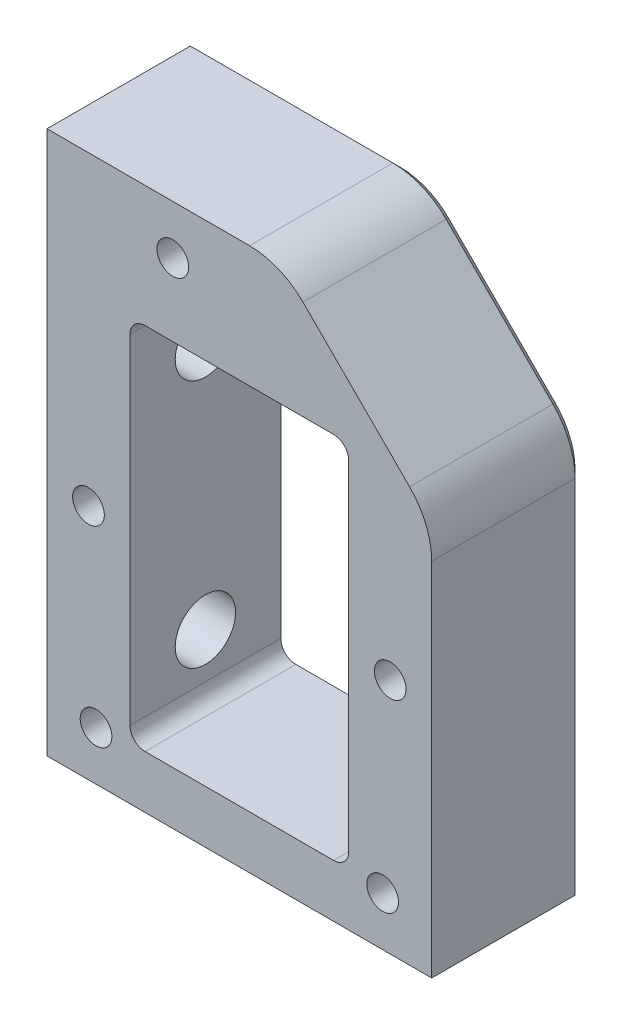
ISO-10303-21;
HEADER;
FILE_DESCRIPTION(('STEP AP214'),'2;1');
FILE_NAME('part.step','',(''),(''),'','','');
FILE_SCHEMA(('AUTOMOTIVE_DESIGN { 1 0 10303 214 1 1 1 1 }'));
ENDSEC;
DATA;
#1=APPLICATION_CONTEXT('core data for automotive mechanical design processes');
#2=APPLICATION_PROTOCOL_DEFINITION('international standard','automotive_design',2000,#1);
#3=PRODUCT_CONTEXT('',#1,'mechanical');
#4=PRODUCT('Part','Part','',(#3));
#5=PRODUCT_RELATED_PRODUCT_CATEGORY('part','',(#4));
#6=PRODUCT_DEFINITION_FORMATION('','',#4);
#7=PRODUCT_DEFINITION_CONTEXT('part definition',#1,'design');
#8=PRODUCT_DEFINITION('design','',#6,#7);
#9=PRODUCT_DEFINITION_SHAPE('','',#8);
#10=(LENGTH_UNIT() NAMED_UNIT(*) SI_UNIT(.MILLI.,.METRE.));
#11=(NAMED_UNIT(*) PLANE_ANGLE_UNIT() SI_UNIT($,.RADIAN.));
#12=(NAMED_UNIT(*) SI_UNIT($,.STERADIAN.) SOLID_ANGLE_UNIT());
#13=UNCERTAINTY_MEASURE_WITH_UNIT(LENGTH_MEASURE(1.E-05),#10,'distance_accuracy_value','');
#14=(GEOMETRIC_REPRESENTATION_CONTEXT(3) GLOBAL_UNCERTAINTY_ASSIGNED_CONTEXT((#13)) GLOBAL_UNIT_ASSIGNED_CONTEXT((#10,
#11,#12)) REPRESENTATION_CONTEXT('',''));
#15=CARTESIAN_POINT('',(0.,0.,0.));
#16=DIRECTION('',(0.,0.,1.));
#17=DIRECTION('',(1.,0.,0.));
#18=AXIS2_PLACEMENT_3D('',#15,#16,#17);
#19=CARTESIAN_POINT('',(0.,0.,20.));
#20=DIRECTION('',(0.,0.,1.));
#21=DIRECTION('',(1.,0.,0.));
#22=AXIS2_PLACEMENT_3D('',#19,#20,#21);
#23=PLANE('',#22);
#24=CARTESIAN_POINT('',(19.,-24.9500000000006,20.));
#25=DIRECTION('',(0.,0.,1.));
#26=DIRECTION('',(1.,0.,0.));
#27=AXIS2_PLACEMENT_3D('',#24,#25,#26);
#28=CIRCLE('',#27,2.1);
#29=CARTESIAN_POINT('',(21.1,-24.9500000000006,20.));
#30=VERTEX_POINT('',#29);
#31=EDGE_CURVE('E802',#30,#30,#28,.T.);
#32=ORIENTED_EDGE('',*,*,#31,.F.);
#33=EDGE_LOOP('',(#32));
#34=FACE_BOUND('',#33,.T.);
#35=CARTESIAN_POINT('',(-8.82106781186559,34.0499999999994,20.));
#36=DIRECTION('',(0.,0.,1.));
#37=DIRECTION('',(1.,0.,0.));
#38=AXIS2_PLACEMENT_3D('',#35,#36,#37);
#39=CIRCLE('',#38,2.1);
#40=CARTESIAN_POINT('',(-6.72106781186559,34.0499999999994,20.));
#41=VERTEX_POINT('',#40);
#42=EDGE_CURVE('E876',#41,#41,#39,.T.);
#43=ORIENTED_EDGE('',*,*,#42,.F.);
#44=EDGE_LOOP('',(#43));
#45=FACE_BOUND('',#44,.T.);
#46=CARTESIAN_POINT('',(-19.0000000000001,-24.9500000000006,20.));
#47=DIRECTION('',(0.,0.,1.));
#48=DIRECTION('',(1.,0.,0.));
#49=AXIS2_PLACEMENT_3D('',#46,#47,#48);
#50=CIRCLE('',#49,2.1);
#51=CARTESIAN_POINT('',(-16.9000000000001,-24.9500000000006,20.));
#52=VERTEX_POINT('',#51);
#53=EDGE_CURVE('E868',#52,#52,#50,.T.);
#54=ORIENTED_EDGE('',*,*,#53,.F.);
#55=EDGE_LOOP('',(#54));
#56=FACE_BOUND('',#55,.T.);
#57=CARTESIAN_POINT('',(20.,0.,20.));
#58=DIRECTION('',(0.,0.,-1.));
#59=DIRECTION('',(-1.,0.,0.));
#60=AXIS2_PLACEMENT_3D('',#57,#58,#59);
#61=CIRCLE('',#60,2.1);
#62=CARTESIAN_POINT('',(17.9,0.,20.));
#63=VERTEX_POINT('',#62);
#64=EDGE_CURVE('E373',#63,#63,#61,.T.);
#65=ORIENTED_EDGE('',*,*,#64,.T.);
#66=EDGE_LOOP('',(#65));
#67=FACE_BOUND('',#66,.T.);
#68=CARTESIAN_POINT('',(-20.,0.,20.));
#69=DIRECTION('',(0.,0.,-1.));
#70=DIRECTION('',(-1.,0.,0.));
#71=AXIS2_PLACEMENT_3D('',#68,#69,#70);
#72=CIRCLE('',#71,2.1);
#73=CARTESIAN_POINT('',(-22.1,0.,20.));
#74=VERTEX_POINT('',#73);
#75=EDGE_CURVE('E340',#74,#74,#72,.T.);
#76=ORIENTED_EDGE('',*,*,#75,.T.);
#77=EDGE_LOOP('',(#76));
#78=FACE_BOUND('',#77,.T.);
#79=DIRECTION('',(0.,1.,0.));
#80=VECTOR('',#79,1.);
#81=CARTESIAN_POINT('',(25.5,20.5499999999995,20.));
#82=LINE('',#81,#80);
#83=CARTESIAN_POINT('',(25.5,-31.4500000000006,20.));
#84=VERTEX_POINT('',#83);
#85=CARTESIAN_POINT('',(25.5,16.4078643762685,20.));
#86=VERTEX_POINT('',#85);
#87=EDGE_CURVE('E188',#84,#86,#82,.T.);
#88=ORIENTED_EDGE('',*,*,#87,.T.);
#89=CARTESIAN_POINT('',(15.5,16.4078643762685,20.));
#90=DIRECTION('',(0.,0.,1.));
#91=DIRECTION('',(1.,0.,0.));
#92=AXIS2_PLACEMENT_3D('',#89,#90,#91);
#93=CIRCLE('',#92,10.);
#94=CARTESIAN_POINT('',(22.5710678118655,23.478932188134,20.));
#95=VERTEX_POINT('',#94);
#96=EDGE_CURVE('E277',#86,#95,#93,.T.);
#97=ORIENTED_EDGE('',*,*,#96,.T.);
#98=DIRECTION('',(-0.707106781186551,0.707106781186544,0.));
#99=VECTOR('',#98,1.);
#100=CARTESIAN_POINT('',(25.5,20.5499999999995,20.));
#101=LINE('',#100,#99);
#102=CARTESIAN_POINT('',(8.4289321881344,37.6210678118649,20.));
#103=VERTEX_POINT('',#102);
#104=EDGE_CURVE('E386',#95,#103,#101,.T.);
#105=ORIENTED_EDGE('',*,*,#104,.T.);
#106=CARTESIAN_POINT('',(1.35786437626895,30.5499999999994,20.));
#107=DIRECTION('',(0.,0.,1.));
#108=DIRECTION('',(1.,0.,0.));
#109=AXIS2_PLACEMENT_3D('',#106,#107,#108);
#110=CIRCLE('',#109,10.);
#111=CARTESIAN_POINT('',(1.35786437626895,40.5499999999994,20.));
#112=VERTEX_POINT('',#111);
#113=EDGE_CURVE('E274',#103,#112,#110,.T.);
#114=ORIENTED_EDGE('',*,*,#113,.T.);
#115=DIRECTION('',(-1.,0.,0.));
#116=VECTOR('',#115,1.);
#117=CARTESIAN_POINT('',(-25.5000000000001,40.5499999999994,20.));
#118=LINE('',#117,#116);
#119=CARTESIAN_POINT('',(-25.5000000000001,40.5499999999994,20.));
#120=VERTEX_POINT('',#119);
#121=EDGE_CURVE('E194',#112,#120,#118,.T.);
#122=ORIENTED_EDGE('',*,*,#121,.T.);
#123=DIRECTION('',(0.,-1.,0.));
#124=VECTOR('',#123,1.);
#125=CARTESIAN_POINT('',(-25.5000000000001,40.5499999999994,20.));
#126=LINE('',#125,#124);
#127=CARTESIAN_POINT('',(-25.5000000000001,-31.4500000000006,20.));
#128=VERTEX_POINT('',#127);
#129=EDGE_CURVE('E189',#120,#128,#126,.T.);
#130=ORIENTED_EDGE('',*,*,#129,.T.);
#131=DIRECTION('',(1.,0.,0.));
#132=VECTOR('',#131,1.);
#133=CARTESIAN_POINT('',(-25.5000000000001,-31.4500000000006,20.));
#134=LINE('',#133,#132);
#135=EDGE_CURVE('E176',#128,#84,#134,.T.);
#136=ORIENTED_EDGE('',*,*,#135,.T.);
#137=EDGE_LOOP('',(#88,#97,#105,#114,#122,#130,#136));
#138=FACE_BOUND('',#137,.T.);
#139=DIRECTION('',(-1.,0.,0.));
#140=VECTOR('',#139,1.);
#141=CARTESIAN_POINT('',(14.5,24.45,20.));
#142=LINE('',#141,#140);
#143=CARTESIAN_POINT('',(12.5,24.45,20.));
#144=VERTEX_POINT('',#143);
#145=CARTESIAN_POINT('',(-12.5,24.45,20.));
#146=VERTEX_POINT('',#145);
#147=EDGE_CURVE('E355',#144,#146,#142,.T.);
#148=ORIENTED_EDGE('',*,*,#147,.F.);
#149=CARTESIAN_POINT('',(12.5,22.45,20.));
#150=DIRECTION('',(0.,0.,1.));
#151=DIRECTION('',(1.,0.,0.));
#152=AXIS2_PLACEMENT_3D('',#149,#150,#151);
#153=CIRCLE('',#152,2.);
#154=CARTESIAN_POINT('',(14.5,22.45,20.));
#155=VERTEX_POINT('',#154);
#156=EDGE_CURVE('E256',#144,#155,#153,.F.);
#157=ORIENTED_EDGE('',*,*,#156,.T.);
#158=DIRECTION('',(0.,1.,0.));
#159=VECTOR('',#158,1.);
#160=CARTESIAN_POINT('',(14.5,24.45,20.));
#161=LINE('',#160,#159);
#162=CARTESIAN_POINT('',(14.5,-22.45,20.));
#163=VERTEX_POINT('',#162);
#164=EDGE_CURVE('E351',#163,#155,#161,.T.);
#165=ORIENTED_EDGE('',*,*,#164,.F.);
#166=CARTESIAN_POINT('',(12.5,-22.45,20.));
#167=DIRECTION('',(0.,0.,1.));
#168=DIRECTION('',(1.,0.,0.));
#169=AXIS2_PLACEMENT_3D('',#166,#167,#168);
#170=CIRCLE('',#169,2.);
#171=CARTESIAN_POINT('',(12.5,-24.45,20.));
#172=VERTEX_POINT('',#171);
#173=EDGE_CURVE('E250',#163,#172,#170,.F.);
#174=ORIENTED_EDGE('',*,*,#173,.T.);
#175=DIRECTION('',(1.,0.,0.));
#176=VECTOR('',#175,1.);
#177=CARTESIAN_POINT('',(14.5,-24.45,20.));
#178=LINE('',#177,#176);
#179=CARTESIAN_POINT('',(-12.5,-24.45,20.));
#180=VERTEX_POINT('',#179);
#181=EDGE_CURVE('E364',#180,#172,#178,.T.);
#182=ORIENTED_EDGE('',*,*,#181,.F.);
#183=CARTESIAN_POINT('',(-12.5,-22.45,20.));
#184=DIRECTION('',(0.,0.,1.));
#185=DIRECTION('',(1.,0.,0.));
#186=AXIS2_PLACEMENT_3D('',#183,#184,#185);
#187=CIRCLE('',#186,2.);
#188=CARTESIAN_POINT('',(-14.5,-22.45,20.));
#189=VERTEX_POINT('',#188);
#190=EDGE_CURVE('E244',#180,#189,#187,.F.);
#191=ORIENTED_EDGE('',*,*,#190,.T.);
#192=DIRECTION('',(0.,-1.,0.));
#193=VECTOR('',#192,1.);
#194=CARTESIAN_POINT('',(-14.5,24.45,20.));
#195=LINE('',#194,#193);
#196=CARTESIAN_POINT('',(-14.5,22.45,20.));
#197=VERTEX_POINT('',#196);
#198=EDGE_CURVE('E360',#197,#189,#195,.T.);
#199=ORIENTED_EDGE('',*,*,#198,.F.);
#200=CARTESIAN_POINT('',(-12.5,22.45,20.));
#201=DIRECTION('',(0.,0.,1.));
#202=DIRECTION('',(1.,0.,0.));
#203=AXIS2_PLACEMENT_3D('',#200,#201,#202);
#204=CIRCLE('',#203,2.);
#205=EDGE_CURVE('E262',#197,#146,#204,.F.);
#206=ORIENTED_EDGE('',*,*,#205,.T.);
#207=EDGE_LOOP('',(#148,#157,#165,#174,#182,#191,#199,#206));
#208=FACE_BOUND('',#207,.T.);
#209=ADVANCED_FACE('F48',(#34,#45,#56,#67,#78,#138,#208),#23,.T.);
#210=CARTESIAN_POINT('',(0.,0.,0.));
#211=DIRECTION('',(0.,0.,1.));
#212=DIRECTION('',(1.,0.,0.));
#213=AXIS2_PLACEMENT_3D('',#210,#211,#212);
#214=PLANE('',#213);
#215=CARTESIAN_POINT('',(20.,0.,0.));
#216=DIRECTION('',(0.,0.,-1.));
#217=DIRECTION('',(-1.,0.,0.));
#218=AXIS2_PLACEMENT_3D('',#215,#216,#217);
#219=CIRCLE('',#218,2.1);
#220=CARTESIAN_POINT('',(17.9,0.,0.));
#221=VERTEX_POINT('',#220);
#222=EDGE_CURVE('E347',#221,#221,#219,.T.);
#223=ORIENTED_EDGE('',*,*,#222,.F.);
#224=EDGE_LOOP('',(#223));
#225=FACE_BOUND('',#224,.T.);
#226=CARTESIAN_POINT('',(-20.,0.,0.));
#227=DIRECTION('',(0.,0.,-1.));
#228=DIRECTION('',(-1.,0.,0.));
#229=AXIS2_PLACEMENT_3D('',#226,#227,#228);
#230=CIRCLE('',#229,2.1);
#231=CARTESIAN_POINT('',(-22.1,0.,0.));
#232=VERTEX_POINT('',#231);
#233=EDGE_CURVE('E332',#232,#232,#230,.T.);
#234=ORIENTED_EDGE('',*,*,#233,.F.);
#235=EDGE_LOOP('',(#234));
#236=FACE_BOUND('',#235,.T.);
#237=CARTESIAN_POINT('',(15.5,16.4078643762685,0.));
#238=DIRECTION('',(0.,0.,1.));
#239=DIRECTION('',(1.,0.,0.));
#240=AXIS2_PLACEMENT_3D('',#237,#238,#239);
#241=CIRCLE('',#240,9.00000000000001);
#242=CARTESIAN_POINT('',(21.8639610306789,22.7718254069475,0.));
#243=VERTEX_POINT('',#242);
#244=CARTESIAN_POINT('',(24.5,16.4078643762685,0.));
#245=VERTEX_POINT('',#244);
#246=EDGE_CURVE('E294',#243,#245,#241,.F.);
#247=ORIENTED_EDGE('',*,*,#246,.T.);
#248=DIRECTION('',(0.,-1.,0.));
#249=VECTOR('',#248,1.);
#250=CARTESIAN_POINT('',(24.5,0.,0.));
#251=LINE('',#250,#249);
#252=CARTESIAN_POINT('',(24.5,-31.4500000000006,0.));
#253=VERTEX_POINT('',#252);
#254=EDGE_CURVE('E300',#245,#253,#251,.T.);
#255=ORIENTED_EDGE('',*,*,#254,.T.);
#256=DIRECTION('',(1.,0.,0.));
#257=VECTOR('',#256,1.);
#258=CARTESIAN_POINT('',(-25.5000000000001,-31.4500000000006,0.));
#259=LINE('',#258,#257);
#260=CARTESIAN_POINT('',(-25.5000000000001,-31.4500000000006,0.));
#261=VERTEX_POINT('',#260);
#262=EDGE_CURVE('E199',#261,#253,#259,.T.);
#263=ORIENTED_EDGE('',*,*,#262,.F.);
#264=DIRECTION('',(0.,-1.,0.));
#265=VECTOR('',#264,1.);
#266=CARTESIAN_POINT('',(-25.5000000000001,40.5499999999994,0.));
#267=LINE('',#266,#265);
#268=CARTESIAN_POINT('',(-25.5000000000001,39.5499999999994,0.));
#269=VERTEX_POINT('',#268);
#270=EDGE_CURVE('E203',#269,#261,#267,.T.);
#271=ORIENTED_EDGE('',*,*,#270,.F.);
#272=DIRECTION('',(1.,0.,0.));
#273=VECTOR('',#272,1.);
#274=CARTESIAN_POINT('',(0.,39.5499999999994,0.));
#275=LINE('',#274,#273);
#276=CARTESIAN_POINT('',(1.35786437626895,39.5499999999994,0.));
#277=VERTEX_POINT('',#276);
#278=EDGE_CURVE('E297',#269,#277,#275,.T.);
#279=ORIENTED_EDGE('',*,*,#278,.T.);
#280=CARTESIAN_POINT('',(1.35786437626895,30.5499999999994,0.));
#281=DIRECTION('',(0.,0.,1.));
#282=DIRECTION('',(1.,0.,0.));
#283=AXIS2_PLACEMENT_3D('',#280,#281,#282);
#284=CIRCLE('',#283,9.00000000000001);
#285=CARTESIAN_POINT('',(7.72182540694785,36.9139610306784,0.));
#286=VERTEX_POINT('',#285);
#287=EDGE_CURVE('E291',#277,#286,#284,.F.);
#288=ORIENTED_EDGE('',*,*,#287,.T.);
#289=DIRECTION('',(0.707106781186551,-0.707106781186544,0.));
#290=VECTOR('',#289,1.);
#291=CARTESIAN_POINT('',(22.3178932188131,22.3178932188133,0.));
#292=LINE('',#291,#290);
#293=EDGE_CURVE('E288',#286,#243,#292,.T.);
#294=ORIENTED_EDGE('',*,*,#293,.T.);
#295=EDGE_LOOP('',(#247,#255,#263,#271,#279,#288,#294));
#296=FACE_BOUND('',#295,.T.);
#297=DIRECTION('',(1.,0.,0.));
#298=VECTOR('',#297,1.);
#299=CARTESIAN_POINT('',(14.5,-24.45,0.));
#300=LINE('',#299,#298);
#301=CARTESIAN_POINT('',(-12.5,-24.45,0.));
#302=VERTEX_POINT('',#301);
#303=CARTESIAN_POINT('',(12.5,-24.45,0.));
#304=VERTEX_POINT('',#303);
#305=EDGE_CURVE('E356',#302,#304,#300,.T.);
#306=ORIENTED_EDGE('',*,*,#305,.T.);
#307=CARTESIAN_POINT('',(12.5,-22.45,0.));
#308=DIRECTION('',(0.,0.,1.));
#309=DIRECTION('',(1.,0.,0.));
#310=AXIS2_PLACEMENT_3D('',#307,#308,#309);
#311=CIRCLE('',#310,2.);
#312=CARTESIAN_POINT('',(14.5,-22.45,0.));
#313=VERTEX_POINT('',#312);
#314=EDGE_CURVE('E247',#304,#313,#311,.T.);
#315=ORIENTED_EDGE('',*,*,#314,.T.);
#316=DIRECTION('',(0.,1.,0.));
#317=VECTOR('',#316,1.);
#318=CARTESIAN_POINT('',(14.5,24.45,0.));
#319=LINE('',#318,#317);
#320=CARTESIAN_POINT('',(14.5,22.45,0.));
#321=VERTEX_POINT('',#320);
#322=EDGE_CURVE('E368',#313,#321,#319,.T.);
#323=ORIENTED_EDGE('',*,*,#322,.T.);
#324=CARTESIAN_POINT('',(12.5,22.45,0.));
#325=DIRECTION('',(0.,0.,1.));
#326=DIRECTION('',(1.,0.,0.));
#327=AXIS2_PLACEMENT_3D('',#324,#325,#326);
#328=CIRCLE('',#327,2.);
#329=CARTESIAN_POINT('',(12.5,24.45,0.));
#330=VERTEX_POINT('',#329);
#331=EDGE_CURVE('E253',#321,#330,#328,.T.);
#332=ORIENTED_EDGE('',*,*,#331,.T.);
#333=DIRECTION('',(-1.,0.,0.));
#334=VECTOR('',#333,1.);
#335=CARTESIAN_POINT('',(14.5,24.45,0.));
#336=LINE('',#335,#334);
#337=CARTESIAN_POINT('',(-12.5,24.45,0.));
#338=VERTEX_POINT('',#337);
#339=EDGE_CURVE('E372',#330,#338,#336,.T.);
#340=ORIENTED_EDGE('',*,*,#339,.T.);
#341=CARTESIAN_POINT('',(-12.5,22.45,0.));
#342=DIRECTION('',(0.,0.,1.));
#343=DIRECTION('',(1.,0.,0.));
#344=AXIS2_PLACEMENT_3D('',#341,#342,#343);
#345=CIRCLE('',#344,2.);
#346=CARTESIAN_POINT('',(-14.5,22.45,0.));
#347=VERTEX_POINT('',#346);
#348=EDGE_CURVE('E259',#338,#347,#345,.T.);
#349=ORIENTED_EDGE('',*,*,#348,.T.);
#350=DIRECTION('',(0.,-1.,0.));
#351=VECTOR('',#350,1.);
#352=CARTESIAN_POINT('',(-14.5,24.45,0.));
#353=LINE('',#352,#351);
#354=CARTESIAN_POINT('',(-14.5,-22.45,0.));
#355=VERTEX_POINT('',#354);
#356=EDGE_CURVE('E377',#347,#355,#353,.T.);
#357=ORIENTED_EDGE('',*,*,#356,.T.);
#358=CARTESIAN_POINT('',(-12.5,-22.45,0.));
#359=DIRECTION('',(0.,0.,1.));
#360=DIRECTION('',(1.,0.,0.));
#361=AXIS2_PLACEMENT_3D('',#358,#359,#360);
#362=CIRCLE('',#361,2.);
#363=EDGE_CURVE('E241',#355,#302,#362,.T.);
#364=ORIENTED_EDGE('',*,*,#363,.T.);
#365=EDGE_LOOP('',(#306,#315,#323,#332,#340,#349,#357,#364));
#366=FACE_BOUND('',#365,.T.);
#367=ADVANCED_FACE('F403',(#225,#236,#296,#366),#214,.F.);
#368=CARTESIAN_POINT('',(-25.5000000000001,40.5499999999994,20.));
#369=DIRECTION('',(1.,0.,0.));
#370=DIRECTION('',(0.,0.,-1.));
#371=AXIS2_PLACEMENT_3D('',#368,#369,#370);
#372=PLANE('',#371);
#373=CARTESIAN_POINT('',(-25.5000000000001,16.5499999999994,10.));
#374=DIRECTION('',(-1.,0.,0.));
#375=DIRECTION('',(0.,0.,1.));
#376=AXIS2_PLACEMENT_3D('',#373,#374,#375);
#377=CIRCLE('',#376,2.1);
#378=CARTESIAN_POINT('',(-25.5000000000001,16.5499999999994,12.1));
#379=VERTEX_POINT('',#378);
#380=EDGE_CURVE('E320',#379,#379,#377,.T.);
#381=ORIENTED_EDGE('',*,*,#380,.F.);
#382=EDGE_LOOP('',(#381));
#383=FACE_BOUND('',#382,.T.);
#384=CARTESIAN_POINT('',(-25.5000000000001,-16.4500000000006,10.));
#385=DIRECTION('',(-1.,0.,0.));
#386=DIRECTION('',(0.,0.,1.));
#387=AXIS2_PLACEMENT_3D('',#384,#385,#386);
#388=CIRCLE('',#387,2.1);
#389=CARTESIAN_POINT('',(-25.5000000000001,-16.4500000000006,12.1));
#390=VERTEX_POINT('',#389);
#391=EDGE_CURVE('E809',#390,#390,#388,.T.);
#392=ORIENTED_EDGE('',*,*,#391,.F.);
#393=EDGE_LOOP('',(#392));
#394=FACE_BOUND('',#393,.T.);
#395=DIRECTION('',(0.,0.,-1.));
#396=VECTOR('',#395,1.);
#397=CARTESIAN_POINT('',(-25.5000000000001,40.5499999999994,20.));
#398=LINE('',#397,#396);
#399=CARTESIAN_POINT('',(-25.5000000000001,40.5499999999994,1.));
#400=VERTEX_POINT('',#399);
#401=EDGE_CURVE('E213',#120,#400,#398,.T.);
#402=ORIENTED_EDGE('',*,*,#401,.T.);
#403=DIRECTION('',(0.,0.707106781186545,0.70710678118655));
#404=VECTOR('',#403,1.);
#405=CARTESIAN_POINT('',(-25.5000000000001,40.5499999999994,1.));
#406=LINE('',#405,#404);
#407=EDGE_CURVE('E309',#400,#269,#406,.F.);
#408=ORIENTED_EDGE('',*,*,#407,.T.);
#409=ORIENTED_EDGE('',*,*,#270,.T.);
#410=DIRECTION('',(0.,0.,-1.));
#411=VECTOR('',#410,1.);
#412=CARTESIAN_POINT('',(-25.5000000000001,-31.4500000000006,20.));
#413=LINE('',#412,#411);
#414=EDGE_CURVE('E181',#128,#261,#413,.T.);
#415=ORIENTED_EDGE('',*,*,#414,.F.);
#416=ORIENTED_EDGE('',*,*,#129,.F.);
#417=EDGE_LOOP('',(#402,#408,#409,#415,#416));
#418=FACE_BOUND('',#417,.T.);
#419=ADVANCED_FACE('F201',(#383,#394,#418),#372,.F.);
#420=CARTESIAN_POINT('',(-25.5000000000001,-31.4500000000006,20.));
#421=DIRECTION('',(0.,1.,0.));
#422=DIRECTION('',(-1.,0.,0.));
#423=AXIS2_PLACEMENT_3D('',#420,#421,#422);
#424=PLANE('',#423);
#425=ORIENTED_EDGE('',*,*,#262,.T.);
#426=DIRECTION('',(-0.707106781186543,0.,-0.707106781186552));
#427=VECTOR('',#426,1.);
#428=CARTESIAN_POINT('',(25.5,-31.4500000000006,1.));
#429=LINE('',#428,#427);
#430=CARTESIAN_POINT('',(25.5,-31.4500000000006,1.));
#431=VERTEX_POINT('',#430);
#432=EDGE_CURVE('E303',#253,#431,#429,.F.);
#433=ORIENTED_EDGE('',*,*,#432,.T.);
#434=DIRECTION('',(0.,0.,-1.));
#435=VECTOR('',#434,1.);
#436=CARTESIAN_POINT('',(25.5,-31.4500000000006,20.));
#437=LINE('',#436,#435);
#438=EDGE_CURVE('E183',#84,#431,#437,.T.);
#439=ORIENTED_EDGE('',*,*,#438,.F.);
#440=ORIENTED_EDGE('',*,*,#135,.F.);
#441=ORIENTED_EDGE('',*,*,#414,.T.);
#442=EDGE_LOOP('',(#425,#433,#439,#440,#441));
#443=FACE_BOUND('',#442,.T.);
#444=ADVANCED_FACE('F179',(#443),#424,.F.);
#445=CARTESIAN_POINT('',(25.5,20.5499999999995,20.));
#446=DIRECTION('',(-1.,0.,0.));
#447=DIRECTION('',(0.,-1.,0.));
#448=AXIS2_PLACEMENT_3D('',#445,#446,#447);
#449=PLANE('',#448);
#450=ORIENTED_EDGE('',*,*,#438,.T.);
#451=DIRECTION('',(0.,1.,0.));
#452=VECTOR('',#451,1.);
#453=CARTESIAN_POINT('',(25.5,20.5499999999995,1.));
#454=LINE('',#453,#452);
#455=CARTESIAN_POINT('',(25.5,16.4078643762685,1.));
#456=VERTEX_POINT('',#455);
#457=EDGE_CURVE('E284',#431,#456,#454,.T.);
#458=ORIENTED_EDGE('',*,*,#457,.T.);
#459=DIRECTION('',(0.,0.,-1.));
#460=VECTOR('',#459,1.);
#461=CARTESIAN_POINT('',(25.5,16.4078643762685,20.));
#462=LINE('',#461,#460);
#463=EDGE_CURVE('E271',#456,#86,#462,.F.);
#464=ORIENTED_EDGE('',*,*,#463,.T.);
#465=ORIENTED_EDGE('',*,*,#87,.F.);
#466=EDGE_LOOP('',(#450,#458,#464,#465));
#467=FACE_BOUND('',#466,.T.);
#468=ADVANCED_FACE('F412',(#467),#449,.F.);
#469=CARTESIAN_POINT('',(25.5,20.5499999999995,20.));
#470=DIRECTION('',(-0.707106781186544,-0.707106781186551,0.));
#471=DIRECTION('',(0.707106781186551,-0.707106781186544,0.));
#472=AXIS2_PLACEMENT_3D('',#469,#470,#471);
#473=PLANE('',#472);
#474=DIRECTION('',(0.,0.,-1.));
#475=VECTOR('',#474,1.);
#476=CARTESIAN_POINT('',(22.5710678118655,23.478932188134,20.));
#477=LINE('',#476,#475);
#478=CARTESIAN_POINT('',(22.5710678118655,23.478932188134,1.));
#479=VERTEX_POINT('',#478);
#480=EDGE_CURVE('E268',#95,#479,#477,.T.);
#481=ORIENTED_EDGE('',*,*,#480,.T.);
#482=DIRECTION('',(-0.707106781186551,0.707106781186544,0.));
#483=VECTOR('',#482,1.);
#484=CARTESIAN_POINT('',(25.5,20.5499999999995,1.));
#485=LINE('',#484,#483);
#486=CARTESIAN_POINT('',(8.4289321881344,37.6210678118649,1.));
#487=VERTEX_POINT('',#486);
#488=EDGE_CURVE('E13',#479,#487,#485,.T.);
#489=ORIENTED_EDGE('',*,*,#488,.T.);
#490=DIRECTION('',(0.,0.,-1.));
#491=VECTOR('',#490,1.);
#492=CARTESIAN_POINT('',(8.4289321881344,37.6210678118649,20.));
#493=LINE('',#492,#491);
#494=EDGE_CURVE('E265',#487,#103,#493,.F.);
#495=ORIENTED_EDGE('',*,*,#494,.T.);
#496=ORIENTED_EDGE('',*,*,#104,.F.);
#497=EDGE_LOOP('',(#481,#489,#495,#496));
#498=FACE_BOUND('',#497,.T.);
#499=ADVANCED_FACE('F417',(#498),#473,.F.);
#500=CARTESIAN_POINT('',(-25.5000000000001,40.5499999999994,20.));
#501=DIRECTION('',(0.,-1.,0.));
#502=DIRECTION('',(0.,0.,-1.));
#503=AXIS2_PLACEMENT_3D('',#500,#501,#502);
#504=PLANE('',#503);
#505=DIRECTION('',(0.,0.,-1.));
#506=VECTOR('',#505,1.);
#507=CARTESIAN_POINT('',(1.35786437626895,40.5499999999994,20.));
#508=LINE('',#507,#506);
#509=CARTESIAN_POINT('',(1.35786437626895,40.5499999999994,1.));
#510=VERTEX_POINT('',#509);
#511=EDGE_CURVE('E280',#112,#510,#508,.T.);
#512=ORIENTED_EDGE('',*,*,#511,.T.);
#513=DIRECTION('',(-1.,0.,0.));
#514=VECTOR('',#513,1.);
#515=CARTESIAN_POINT('',(-25.5000000000001,40.5499999999994,1.));
#516=LINE('',#515,#514);
#517=EDGE_CURVE('E306',#510,#400,#516,.T.);
#518=ORIENTED_EDGE('',*,*,#517,.T.);
#519=ORIENTED_EDGE('',*,*,#401,.F.);
#520=ORIENTED_EDGE('',*,*,#121,.F.);
#521=EDGE_LOOP('',(#512,#518,#519,#520));
#522=FACE_BOUND('',#521,.T.);
#523=ADVANCED_FACE('F450',(#522),#504,.F.);
#524=CARTESIAN_POINT('',(14.5,24.45,20.));
#525=DIRECTION('',(-1.,0.,0.));
#526=DIRECTION('',(0.,-1.,0.));
#527=AXIS2_PLACEMENT_3D('',#524,#525,#526);
#528=PLANE('',#527);
#529=ORIENTED_EDGE('',*,*,#322,.F.);
#530=DIRECTION('',(0.,0.,-1.));
#531=VECTOR('',#530,1.);
#532=CARTESIAN_POINT('',(14.5,-22.45,20.));
#533=LINE('',#532,#531);
#534=EDGE_CURVE('E231',#313,#163,#533,.F.);
#535=ORIENTED_EDGE('',*,*,#534,.T.);
#536=ORIENTED_EDGE('',*,*,#164,.T.);
#537=DIRECTION('',(0.,0.,-1.));
#538=VECTOR('',#537,1.);
#539=CARTESIAN_POINT('',(14.5,22.45,0.));
#540=LINE('',#539,#538);
#541=EDGE_CURVE('E227',#155,#321,#540,.T.);
#542=ORIENTED_EDGE('',*,*,#541,.T.);
#543=EDGE_LOOP('',(#529,#535,#536,#542));
#544=FACE_BOUND('',#543,.T.);
#545=ADVANCED_FACE('F447',(#544),#528,.T.);
#546=CARTESIAN_POINT('',(14.5,24.45,20.));
#547=DIRECTION('',(0.,-1.,0.));
#548=DIRECTION('',(1.,0.,0.));
#549=AXIS2_PLACEMENT_3D('',#546,#547,#548);
#550=PLANE('',#549);
#551=ORIENTED_EDGE('',*,*,#339,.F.);
#552=DIRECTION('',(0.,0.,-1.));
#553=VECTOR('',#552,1.);
#554=CARTESIAN_POINT('',(12.5,24.45,20.));
#555=LINE('',#554,#553);
#556=EDGE_CURVE('E238',#330,#144,#555,.F.);
#557=ORIENTED_EDGE('',*,*,#556,.T.);
#558=ORIENTED_EDGE('',*,*,#147,.T.);
#559=DIRECTION('',(0.,0.,-1.));
#560=VECTOR('',#559,1.);
#561=CARTESIAN_POINT('',(-12.5,24.45,0.));
#562=LINE('',#561,#560);
#563=EDGE_CURVE('E234',#146,#338,#562,.T.);
#564=ORIENTED_EDGE('',*,*,#563,.T.);
#565=EDGE_LOOP('',(#551,#557,#558,#564));
#566=FACE_BOUND('',#565,.T.);
#567=ADVANCED_FACE('F642',(#566),#550,.T.);
#568=CARTESIAN_POINT('',(-14.5,24.45,20.));
#569=DIRECTION('',(1.,0.,0.));
#570=DIRECTION('',(0.,1.,0.));
#571=AXIS2_PLACEMENT_3D('',#568,#569,#570);
#572=PLANE('',#571);
#573=CARTESIAN_POINT('',(-14.5,16.5499999999994,10.));
#574=DIRECTION('',(1.,0.,0.));
#575=DIRECTION('',(0.,1.,0.));
#576=AXIS2_PLACEMENT_3D('',#573,#574,#575);
#577=CIRCLE('',#576,4.);
#578=CARTESIAN_POINT('',(-14.5,20.5499999999994,10.));
#579=VERTEX_POINT('',#578);
#580=EDGE_CURVE('E788',#579,#579,#577,.F.);
#581=ORIENTED_EDGE('',*,*,#580,.T.);
#582=EDGE_LOOP('',(#581));
#583=FACE_BOUND('',#582,.T.);
#584=CARTESIAN_POINT('',(-14.5,-16.4500000000006,10.));
#585=DIRECTION('',(1.,0.,0.));
#586=DIRECTION('',(0.,1.,0.));
#587=AXIS2_PLACEMENT_3D('',#584,#585,#586);
#588=CIRCLE('',#587,4.);
#589=CARTESIAN_POINT('',(-14.5,-12.4500000000006,10.));
#590=VERTEX_POINT('',#589);
#591=EDGE_CURVE('E791',#590,#590,#588,.F.);
#592=ORIENTED_EDGE('',*,*,#591,.T.);
#593=EDGE_LOOP('',(#592));
#594=FACE_BOUND('',#593,.T.);
#595=ORIENTED_EDGE('',*,*,#198,.T.);
#596=DIRECTION('',(0.,0.,-1.));
#597=VECTOR('',#596,1.);
#598=CARTESIAN_POINT('',(-14.5,-22.45,0.));
#599=LINE('',#598,#597);
#600=EDGE_CURVE('E211',#189,#355,#599,.T.);
#601=ORIENTED_EDGE('',*,*,#600,.T.);
#602=ORIENTED_EDGE('',*,*,#356,.F.);
#603=DIRECTION('',(0.,0.,-1.));
#604=VECTOR('',#603,1.);
#605=CARTESIAN_POINT('',(-14.5,22.45,20.));
#606=LINE('',#605,#604);
#607=EDGE_CURVE('E206',#347,#197,#606,.F.);
#608=ORIENTED_EDGE('',*,*,#607,.T.);
#609=EDGE_LOOP('',(#595,#601,#602,#608));
#610=FACE_BOUND('',#609,.T.);
#611=ADVANCED_FACE('F639',(#583,#594,#610),#572,.T.);
#612=CARTESIAN_POINT('',(14.5,-24.45,20.));
#613=DIRECTION('',(0.,1.,0.));
#614=DIRECTION('',(-1.,0.,0.));
#615=AXIS2_PLACEMENT_3D('',#612,#613,#614);
#616=PLANE('',#615);
#617=ORIENTED_EDGE('',*,*,#305,.F.);
#618=DIRECTION('',(0.,0.,-1.));
#619=VECTOR('',#618,1.);
#620=CARTESIAN_POINT('',(-12.5,-24.45,20.));
#621=LINE('',#620,#619);
#622=EDGE_CURVE('E224',#302,#180,#621,.F.);
#623=ORIENTED_EDGE('',*,*,#622,.T.);
#624=ORIENTED_EDGE('',*,*,#181,.T.);
#625=DIRECTION('',(0.,0.,-1.));
#626=VECTOR('',#625,1.);
#627=CARTESIAN_POINT('',(12.5,-24.45,0.));
#628=LINE('',#627,#626);
#629=EDGE_CURVE('E220',#172,#304,#628,.T.);
#630=ORIENTED_EDGE('',*,*,#629,.T.);
#631=EDGE_LOOP('',(#617,#623,#624,#630));
#632=FACE_BOUND('',#631,.T.);
#633=ADVANCED_FACE('F635',(#632),#616,.T.);
#634=CARTESIAN_POINT('',(-20.,0.,20.));
#635=DIRECTION('',(0.,0.,-1.));
#636=DIRECTION('',(-1.,0.,0.));
#637=AXIS2_PLACEMENT_3D('',#634,#635,#636);
#638=CYLINDRICAL_SURFACE('',#637,2.1);
#639=ORIENTED_EDGE('',*,*,#75,.F.);
#640=EDGE_LOOP('',(#639));
#641=FACE_BOUND('',#640,.T.);
#642=ORIENTED_EDGE('',*,*,#233,.T.);
#643=EDGE_LOOP('',(#642));
#644=FACE_BOUND('',#643,.T.);
#645=ADVANCED_FACE('F631',(#641,#644),#638,.F.);
#646=CARTESIAN_POINT('',(20.,0.,20.));
#647=DIRECTION('',(0.,0.,-1.));
#648=DIRECTION('',(-1.,0.,0.));
#649=AXIS2_PLACEMENT_3D('',#646,#647,#648);
#650=CYLINDRICAL_SURFACE('',#649,2.1);
#651=ORIENTED_EDGE('',*,*,#64,.F.);
#652=EDGE_LOOP('',(#651));
#653=FACE_BOUND('',#652,.T.);
#654=ORIENTED_EDGE('',*,*,#222,.T.);
#655=EDGE_LOOP('',(#654));
#656=FACE_BOUND('',#655,.T.);
#657=ADVANCED_FACE('F466',(#653,#656),#650,.F.);
#658=CARTESIAN_POINT('',(-12.5,-22.45,20.));
#659=DIRECTION('',(0.,0.,1.));
#660=DIRECTION('',(1.,0.,0.));
#661=AXIS2_PLACEMENT_3D('',#658,#659,#660);
#662=CYLINDRICAL_SURFACE('',#661,2.);
#663=ORIENTED_EDGE('',*,*,#190,.F.);
#664=ORIENTED_EDGE('',*,*,#622,.F.);
#665=ORIENTED_EDGE('',*,*,#363,.F.);
#666=ORIENTED_EDGE('',*,*,#600,.F.);
#667=EDGE_LOOP('',(#663,#664,#665,#666));
#668=FACE_BOUND('',#667,.T.);
#669=ADVANCED_FACE('F462',(#668),#662,.F.);
#670=CARTESIAN_POINT('',(12.5,-22.45,20.));
#671=DIRECTION('',(0.,0.,1.));
#672=DIRECTION('',(1.,0.,0.));
#673=AXIS2_PLACEMENT_3D('',#670,#671,#672);
#674=CYLINDRICAL_SURFACE('',#673,2.);
#675=ORIENTED_EDGE('',*,*,#173,.F.);
#676=ORIENTED_EDGE('',*,*,#534,.F.);
#677=ORIENTED_EDGE('',*,*,#314,.F.);
#678=ORIENTED_EDGE('',*,*,#629,.F.);
#679=EDGE_LOOP('',(#675,#676,#677,#678));
#680=FACE_BOUND('',#679,.T.);
#681=ADVANCED_FACE('F465',(#680),#674,.F.);
#682=CARTESIAN_POINT('',(12.5,22.45,20.));
#683=DIRECTION('',(0.,0.,1.));
#684=DIRECTION('',(1.,0.,0.));
#685=AXIS2_PLACEMENT_3D('',#682,#683,#684);
#686=CYLINDRICAL_SURFACE('',#685,2.);
#687=ORIENTED_EDGE('',*,*,#156,.F.);
#688=ORIENTED_EDGE('',*,*,#556,.F.);
#689=ORIENTED_EDGE('',*,*,#331,.F.);
#690=ORIENTED_EDGE('',*,*,#541,.F.);
#691=EDGE_LOOP('',(#687,#688,#689,#690));
#692=FACE_BOUND('',#691,.T.);
#693=ADVANCED_FACE('F470',(#692),#686,.F.);
#694=CARTESIAN_POINT('',(-12.5,22.45,20.));
#695=DIRECTION('',(0.,0.,1.));
#696=DIRECTION('',(1.,0.,0.));
#697=AXIS2_PLACEMENT_3D('',#694,#695,#696);
#698=CYLINDRICAL_SURFACE('',#697,2.);
#699=ORIENTED_EDGE('',*,*,#205,.F.);
#700=ORIENTED_EDGE('',*,*,#607,.F.);
#701=ORIENTED_EDGE('',*,*,#348,.F.);
#702=ORIENTED_EDGE('',*,*,#563,.F.);
#703=EDGE_LOOP('',(#699,#700,#701,#702));
#704=FACE_BOUND('',#703,.T.);
#705=ADVANCED_FACE('F474',(#704),#698,.F.);
#706=CARTESIAN_POINT('',(15.5,16.4078643762685,20.));
#707=DIRECTION('',(0.,0.,-1.));
#708=DIRECTION('',(-1.,0.,0.));
#709=AXIS2_PLACEMENT_3D('',#706,#707,#708);
#710=CYLINDRICAL_SURFACE('',#709,10.);
#711=ORIENTED_EDGE('',*,*,#463,.F.);
#712=CARTESIAN_POINT('',(15.5,16.4078643762685,1.));
#713=DIRECTION('',(0.,0.,1.));
#714=DIRECTION('',(1.,0.,0.));
#715=AXIS2_PLACEMENT_3D('',#712,#713,#714);
#716=CIRCLE('',#715,10.);
#717=EDGE_CURVE('E72',#456,#479,#716,.T.);
#718=ORIENTED_EDGE('',*,*,#717,.T.);
#719=ORIENTED_EDGE('',*,*,#480,.F.);
#720=ORIENTED_EDGE('',*,*,#96,.F.);
#721=EDGE_LOOP('',(#711,#718,#719,#720));
#722=FACE_BOUND('',#721,.T.);
#723=ADVANCED_FACE('F414',(#722),#710,.T.);
#724=CARTESIAN_POINT('',(1.35786437626895,30.5499999999994,20.));
#725=DIRECTION('',(0.,0.,-1.));
#726=DIRECTION('',(-1.,0.,0.));
#727=AXIS2_PLACEMENT_3D('',#724,#725,#726);
#728=CYLINDRICAL_SURFACE('',#727,10.);
#729=ORIENTED_EDGE('',*,*,#494,.F.);
#730=CARTESIAN_POINT('',(1.35786437626895,30.5499999999994,1.));
#731=DIRECTION('',(0.,0.,1.));
#732=DIRECTION('',(1.,0.,0.));
#733=AXIS2_PLACEMENT_3D('',#730,#731,#732);
#734=CIRCLE('',#733,10.);
#735=EDGE_CURVE('E58',#487,#510,#734,.T.);
#736=ORIENTED_EDGE('',*,*,#735,.T.);
#737=ORIENTED_EDGE('',*,*,#511,.F.);
#738=ORIENTED_EDGE('',*,*,#113,.F.);
#739=EDGE_LOOP('',(#729,#736,#737,#738));
#740=FACE_BOUND('',#739,.T.);
#741=ADVANCED_FACE('F419',(#740),#728,.T.);
#742=CARTESIAN_POINT('',(-25.5000000000001,40.5499999999994,1.));
#743=DIRECTION('',(0.,-0.70710678118655,0.707106781186545));
#744=DIRECTION('',(-1.,0.,0.));
#745=AXIS2_PLACEMENT_3D('',#742,#743,#744);
#746=PLANE('',#745);
#747=ORIENTED_EDGE('',*,*,#407,.F.);
#748=ORIENTED_EDGE('',*,*,#517,.F.);
#749=DIRECTION('',(0.,0.707106781186545,0.70710678118655));
#750=VECTOR('',#749,1.);
#751=CARTESIAN_POINT('',(1.35786437626895,39.5499999999994,0.));
#752=LINE('',#751,#750);
#753=EDGE_CURVE('E52',#277,#510,#752,.T.);
#754=ORIENTED_EDGE('',*,*,#753,.F.);
#755=ORIENTED_EDGE('',*,*,#278,.F.);
#756=EDGE_LOOP('',(#747,#748,#754,#755));
#757=FACE_BOUND('',#756,.T.);
#758=ADVANCED_FACE('F50',(#757),#746,.F.);
#759=CARTESIAN_POINT('',(1.35786437626895,30.5499999999994,0.));
#760=DIRECTION('',(0.,0.,1.));
#761=DIRECTION('',(1.,0.,0.));
#762=AXIS2_PLACEMENT_3D('',#759,#760,#761);
#763=CONICAL_SURFACE('',#762,9.00000000000001,0.785398163397444);
#764=ORIENTED_EDGE('',*,*,#753,.T.);
#765=ORIENTED_EDGE('',*,*,#735,.F.);
#766=DIRECTION('',(0.499999999999996,0.5,0.707106781186551));
#767=VECTOR('',#766,1.);
#768=CARTESIAN_POINT('',(7.72182540694785,36.9139610306784,0.));
#769=LINE('',#768,#767);
#770=EDGE_CURVE('E323',#286,#487,#769,.T.);
#771=ORIENTED_EDGE('',*,*,#770,.F.);
#772=ORIENTED_EDGE('',*,*,#287,.F.);
#773=EDGE_LOOP('',(#764,#765,#771,#772));
#774=FACE_BOUND('',#773,.T.);
#775=ADVANCED_FACE('F421',(#774),#763,.T.);
#776=CARTESIAN_POINT('',(25.5,20.5499999999995,1.));
#777=DIRECTION('',(-0.5,-0.500000000000005,0.707106781186544));
#778=DIRECTION('',(-0.707106781186551,0.707106781186544,0.));
#779=AXIS2_PLACEMENT_3D('',#776,#777,#778);
#780=PLANE('',#779);
#781=ORIENTED_EDGE('',*,*,#770,.T.);
#782=ORIENTED_EDGE('',*,*,#488,.F.);
#783=DIRECTION('',(0.499999999999995,0.5,0.707106781186551));
#784=VECTOR('',#783,1.);
#785=CARTESIAN_POINT('',(21.8639610306789,22.7718254069475,0.));
#786=LINE('',#785,#784);
#787=EDGE_CURVE('E319',#243,#479,#786,.T.);
#788=ORIENTED_EDGE('',*,*,#787,.F.);
#789=ORIENTED_EDGE('',*,*,#293,.F.);
#790=EDGE_LOOP('',(#781,#782,#788,#789));
#791=FACE_BOUND('',#790,.T.);
#792=ADVANCED_FACE('F423',(#791),#780,.F.);
#793=CARTESIAN_POINT('',(15.5,16.4078643762685,0.));
#794=DIRECTION('',(0.,0.,1.));
#795=DIRECTION('',(1.,0.,0.));
#796=AXIS2_PLACEMENT_3D('',#793,#794,#795);
#797=CONICAL_SURFACE('',#796,9.00000000000001,0.785398163397443);
#798=ORIENTED_EDGE('',*,*,#787,.T.);
#799=ORIENTED_EDGE('',*,*,#717,.F.);
#800=DIRECTION('',(0.707106781186544,0.,0.707106781186551));
#801=VECTOR('',#800,1.);
#802=CARTESIAN_POINT('',(24.5,16.4078643762685,0.));
#803=LINE('',#802,#801);
#804=EDGE_CURVE('E316',#245,#456,#803,.T.);
#805=ORIENTED_EDGE('',*,*,#804,.F.);
#806=ORIENTED_EDGE('',*,*,#246,.F.);
#807=EDGE_LOOP('',(#798,#799,#805,#806));
#808=FACE_BOUND('',#807,.T.);
#809=ADVANCED_FACE('F426',(#808),#797,.T.);
#810=CARTESIAN_POINT('',(25.5,20.5499999999995,1.));
#811=DIRECTION('',(-0.707106781186552,0.,0.707106781186543));
#812=DIRECTION('',(0.,1.,0.));
#813=AXIS2_PLACEMENT_3D('',#810,#811,#812);
#814=PLANE('',#813);
#815=ORIENTED_EDGE('',*,*,#432,.F.);
#816=ORIENTED_EDGE('',*,*,#254,.F.);
#817=ORIENTED_EDGE('',*,*,#804,.T.);
#818=ORIENTED_EDGE('',*,*,#457,.F.);
#819=EDGE_LOOP('',(#815,#816,#817,#818));
#820=FACE_BOUND('',#819,.T.);
#821=ADVANCED_FACE('F409',(#820),#814,.F.);
#822=CARTESIAN_POINT('',(25.501,-16.4500000000006,10.));
#823=DIRECTION('',(-1.,0.,0.));
#824=DIRECTION('',(0.,0.,1.));
#825=AXIS2_PLACEMENT_3D('',#822,#823,#824);
#826=CYLINDRICAL_SURFACE('',#825,2.1);
#827=CARTESIAN_POINT('',(-20.5000000000001,-16.4500000000006,10.));
#828=DIRECTION('',(-1.,0.,0.));
#829=DIRECTION('',(0.,0.,1.));
#830=AXIS2_PLACEMENT_3D('',#827,#828,#829);
#831=CIRCLE('',#830,2.1);
#832=CARTESIAN_POINT('',(-20.5000000000001,-16.4500000000006,12.1));
#833=VERTEX_POINT('',#832);
#834=EDGE_CURVE('E800',#833,#833,#831,.T.);
#835=ORIENTED_EDGE('',*,*,#834,.F.);
#836=EDGE_LOOP('',(#835));
#837=FACE_BOUND('',#836,.T.);
#838=ORIENTED_EDGE('',*,*,#391,.T.);
#839=EDGE_LOOP('',(#838));
#840=FACE_BOUND('',#839,.T.);
#841=ADVANCED_FACE('F433',(#837,#840),#826,.F.);
#842=CARTESIAN_POINT('',(25.501,16.5499999999994,10.));
#843=DIRECTION('',(-1.,0.,0.));
#844=DIRECTION('',(0.,0.,1.));
#845=AXIS2_PLACEMENT_3D('',#842,#843,#844);
#846=CYLINDRICAL_SURFACE('',#845,2.1);
#847=CARTESIAN_POINT('',(-20.5000000000001,16.5499999999994,10.));
#848=DIRECTION('',(-1.,0.,0.));
#849=DIRECTION('',(0.,0.,1.));
#850=AXIS2_PLACEMENT_3D('',#847,#848,#849);
#851=CIRCLE('',#850,2.1);
#852=CARTESIAN_POINT('',(-20.5000000000001,16.5499999999994,12.1));
#853=VERTEX_POINT('',#852);
#854=EDGE_CURVE('E813',#853,#853,#851,.T.);
#855=ORIENTED_EDGE('',*,*,#854,.F.);
#856=EDGE_LOOP('',(#855));
#857=FACE_BOUND('',#856,.T.);
#858=ORIENTED_EDGE('',*,*,#380,.T.);
#859=EDGE_LOOP('',(#858));
#860=FACE_BOUND('',#859,.T.);
#861=ADVANCED_FACE('F513',(#857,#860),#846,.F.);
#862=CARTESIAN_POINT('',(-20.5000000000001,16.5499999999994,10.));
#863=DIRECTION('',(-1.,0.,0.));
#864=DIRECTION('',(0.,0.,1.));
#865=AXIS2_PLACEMENT_3D('',#862,#863,#864);
#866=PLANE('',#865);
#867=ORIENTED_EDGE('',*,*,#854,.T.);
#868=EDGE_LOOP('',(#867));
#869=FACE_BOUND('',#868,.T.);
#870=CARTESIAN_POINT('',(-20.5000000000001,16.5499999999994,10.));
#871=DIRECTION('',(-1.,0.,0.));
#872=DIRECTION('',(0.,0.,1.));
#873=AXIS2_PLACEMENT_3D('',#870,#871,#872);
#874=CIRCLE('',#873,4.);
#875=CARTESIAN_POINT('',(-20.5000000000001,16.5499999999994,14.));
#876=VERTEX_POINT('',#875);
#877=EDGE_CURVE('E848',#876,#876,#874,.T.);
#878=ORIENTED_EDGE('',*,*,#877,.F.);
#879=EDGE_LOOP('',(#878));
#880=FACE_BOUND('',#879,.T.);
#881=ADVANCED_FACE('F523',(#869,#880),#866,.F.);
#882=CARTESIAN_POINT('',(25.501,16.5499999999994,10.));
#883=DIRECTION('',(-1.,0.,0.));
#884=DIRECTION('',(0.,0.,1.));
#885=AXIS2_PLACEMENT_3D('',#882,#883,#884);
#886=CYLINDRICAL_SURFACE('',#885,4.);
#887=ORIENTED_EDGE('',*,*,#580,.F.);
#888=EDGE_LOOP('',(#887));
#889=FACE_BOUND('',#888,.T.);
#890=ORIENTED_EDGE('',*,*,#877,.T.);
#891=EDGE_LOOP('',(#890));
#892=FACE_BOUND('',#891,.T.);
#893=ADVANCED_FACE('F533',(#889,#892),#886,.F.);
#894=CARTESIAN_POINT('',(-20.5000000000001,-16.4500000000006,10.));
#895=DIRECTION('',(-1.,0.,0.));
#896=DIRECTION('',(0.,0.,1.));
#897=AXIS2_PLACEMENT_3D('',#894,#895,#896);
#898=PLANE('',#897);
#899=ORIENTED_EDGE('',*,*,#834,.T.);
#900=EDGE_LOOP('',(#899));
#901=FACE_BOUND('',#900,.T.);
#902=CARTESIAN_POINT('',(-20.5000000000001,-16.4500000000006,10.));
#903=DIRECTION('',(-1.,0.,0.));
#904=DIRECTION('',(0.,0.,1.));
#905=AXIS2_PLACEMENT_3D('',#902,#903,#904);
#906=CIRCLE('',#905,4.);
#907=CARTESIAN_POINT('',(-20.5000000000001,-16.4500000000006,14.));
#908=VERTEX_POINT('',#907);
#909=EDGE_CURVE('E793',#908,#908,#906,.T.);
#910=ORIENTED_EDGE('',*,*,#909,.F.);
#911=EDGE_LOOP('',(#910));
#912=FACE_BOUND('',#911,.T.);
#913=ADVANCED_FACE('F543',(#901,#912),#898,.F.);
#914=CARTESIAN_POINT('',(25.501,-16.4500000000006,10.));
#915=DIRECTION('',(-1.,0.,0.));
#916=DIRECTION('',(0.,0.,1.));
#917=AXIS2_PLACEMENT_3D('',#914,#915,#916);
#918=CYLINDRICAL_SURFACE('',#917,4.);
#919=ORIENTED_EDGE('',*,*,#591,.F.);
#920=EDGE_LOOP('',(#919));
#921=FACE_BOUND('',#920,.T.);
#922=ORIENTED_EDGE('',*,*,#909,.T.);
#923=EDGE_LOOP('',(#922));
#924=FACE_BOUND('',#923,.T.);
#925=ADVANCED_FACE('F553',(#921,#924),#918,.F.);
#926=CARTESIAN_POINT('',(-19.0000000000001,-24.9500000000006,10.));
#927=DIRECTION('',(0.,0.,1.));
#928=DIRECTION('',(1.,0.,0.));
#929=AXIS2_PLACEMENT_3D('',#926,#927,#928);
#930=CYLINDRICAL_SURFACE('',#929,2.1);
#931=CARTESIAN_POINT('',(-19.0000000000001,-24.9500000000006,10.));
#932=DIRECTION('',(0.,0.,1.));
#933=DIRECTION('',(1.,0.,0.));
#934=AXIS2_PLACEMENT_3D('',#931,#932,#933);
#935=CIRCLE('',#934,2.1);
#936=CARTESIAN_POINT('',(-16.9000000000001,-24.9500000000006,10.));
#937=VERTEX_POINT('',#936);
#938=EDGE_CURVE('E872',#937,#937,#935,.T.);
#939=ORIENTED_EDGE('',*,*,#938,.F.);
#940=EDGE_LOOP('',(#939));
#941=FACE_BOUND('',#940,.T.);
#942=ORIENTED_EDGE('',*,*,#53,.T.);
#943=EDGE_LOOP('',(#942));
#944=FACE_BOUND('',#943,.T.);
#945=ADVANCED_FACE('F563',(#941,#944),#930,.F.);
#946=CARTESIAN_POINT('',(-19.0000000000001,-24.9500000000006,10.));
#947=DIRECTION('',(0.,0.,1.));
#948=DIRECTION('',(1.,0.,0.));
#949=AXIS2_PLACEMENT_3D('',#946,#947,#948);
#950=PLANE('',#949);
#951=ORIENTED_EDGE('',*,*,#938,.T.);
#952=EDGE_LOOP('',(#951));
#953=FACE_BOUND('',#952,.T.);
#954=ADVANCED_FACE('F573',(#953),#950,.T.);
#955=CARTESIAN_POINT('',(-8.82106781186559,34.0499999999994,10.));
#956=DIRECTION('',(0.,0.,1.));
#957=DIRECTION('',(1.,0.,0.));
#958=AXIS2_PLACEMENT_3D('',#955,#956,#957);
#959=CYLINDRICAL_SURFACE('',#958,2.1);
#960=CARTESIAN_POINT('',(-8.82106781186559,34.0499999999994,10.));
#961=DIRECTION('',(0.,0.,1.));
#962=DIRECTION('',(1.,0.,0.));
#963=AXIS2_PLACEMENT_3D('',#960,#961,#962);
#964=CIRCLE('',#963,2.1);
#965=CARTESIAN_POINT('',(-6.72106781186559,34.0499999999994,10.));
#966=VERTEX_POINT('',#965);
#967=EDGE_CURVE('E880',#966,#966,#964,.T.);
#968=ORIENTED_EDGE('',*,*,#967,.F.);
#969=EDGE_LOOP('',(#968));
#970=FACE_BOUND('',#969,.T.);
#971=ORIENTED_EDGE('',*,*,#42,.T.);
#972=EDGE_LOOP('',(#971));
#973=FACE_BOUND('',#972,.T.);
#974=ADVANCED_FACE('F583',(#970,#973),#959,.F.);
#975=CARTESIAN_POINT('',(-8.82106781186559,34.0499999999994,10.));
#976=DIRECTION('',(0.,0.,1.));
#977=DIRECTION('',(1.,0.,0.));
#978=AXIS2_PLACEMENT_3D('',#975,#976,#977);
#979=PLANE('',#978);
#980=ORIENTED_EDGE('',*,*,#967,.T.);
#981=EDGE_LOOP('',(#980));
#982=FACE_BOUND('',#981,.T.);
#983=ADVANCED_FACE('F593',(#982),#979,.T.);
#984=CARTESIAN_POINT('',(19.,-24.9500000000006,10.));
#985=DIRECTION('',(0.,0.,1.));
#986=DIRECTION('',(1.,0.,0.));
#987=AXIS2_PLACEMENT_3D('',#984,#985,#986);
#988=CYLINDRICAL_SURFACE('',#987,2.1);
#989=CARTESIAN_POINT('',(19.,-24.9500000000006,10.));
#990=DIRECTION('',(0.,0.,1.));
#991=DIRECTION('',(1.,0.,0.));
#992=AXIS2_PLACEMENT_3D('',#989,#990,#991);
#993=CIRCLE('',#992,2.1);
#994=CARTESIAN_POINT('',(21.1,-24.9500000000006,10.));
#995=VERTEX_POINT('',#994);
#996=EDGE_CURVE('E794',#995,#995,#993,.T.);
#997=ORIENTED_EDGE('',*,*,#996,.F.);
#998=EDGE_LOOP('',(#997));
#999=FACE_BOUND('',#998,.T.);
#1000=ORIENTED_EDGE('',*,*,#31,.T.);
#1001=EDGE_LOOP('',(#1000));
#1002=FACE_BOUND('',#1001,.T.);
#1003=ADVANCED_FACE('F603',(#999,#1002),#988,.F.);
#1004=CARTESIAN_POINT('',(19.,-24.9500000000006,10.));
#1005=DIRECTION('',(0.,0.,1.));
#1006=DIRECTION('',(1.,0.,0.));
#1007=AXIS2_PLACEMENT_3D('',#1004,#1005,#1006);
#1008=PLANE('',#1007);
#1009=ORIENTED_EDGE('',*,*,#996,.T.);
#1010=EDGE_LOOP('',(#1009));
#1011=FACE_BOUND('',#1010,.T.);
#1012=ADVANCED_FACE('F613',(#1011),#1008,.T.);
#1013=CLOSED_SHELL('',(#209,#367,#419,#444,#468,#499,#523,#545,#567,#611,#633,#645,#657,#669,
#681,#693,#705,#723,#741,#758,#775,#792,#809,#821,#841,#861,#881,#893,#913,#925,#945,#954,#974,
#983,#1003,#1012));
#1014=MANIFOLD_SOLID_BREP('B2',#1013);
#1015=ADVANCED_BREP_SHAPE_REPRESENTATION('',(#18,#1014),#14);
#1016=SHAPE_DEFINITION_REPRESENTATION(#9,#1015);
ENDSEC;
END-ISO-10303-21;
